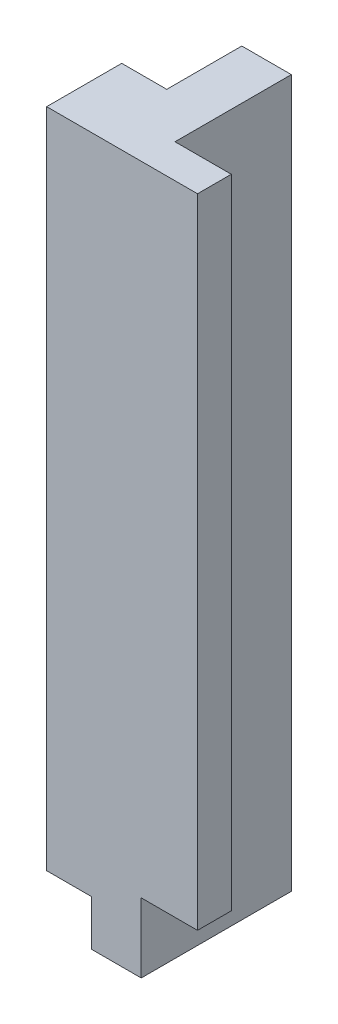
ISO-10303-21;
HEADER;
FILE_DESCRIPTION(('STEP AP214'),'2;1');
FILE_NAME('part.step','',(''),(''),'','','');
FILE_SCHEMA(('AUTOMOTIVE_DESIGN { 1 0 10303 214 1 1 1 1 }'));
ENDSEC;
DATA;
#1=APPLICATION_CONTEXT('core data for automotive mechanical design processes');
#2=APPLICATION_PROTOCOL_DEFINITION('international standard','automotive_design',2000,#1);
#3=PRODUCT_CONTEXT('',#1,'mechanical');
#4=PRODUCT('Part','Part','',(#3));
#5=PRODUCT_RELATED_PRODUCT_CATEGORY('part','',(#4));
#6=PRODUCT_DEFINITION_FORMATION('','',#4);
#7=PRODUCT_DEFINITION_CONTEXT('part definition',#1,'design');
#8=PRODUCT_DEFINITION('design','',#6,#7);
#9=PRODUCT_DEFINITION_SHAPE('','',#8);
#10=(LENGTH_UNIT() NAMED_UNIT(*) SI_UNIT(.MILLI.,.METRE.));
#11=(NAMED_UNIT(*) PLANE_ANGLE_UNIT() SI_UNIT($,.RADIAN.));
#12=(NAMED_UNIT(*) SI_UNIT($,.STERADIAN.) SOLID_ANGLE_UNIT());
#13=UNCERTAINTY_MEASURE_WITH_UNIT(LENGTH_MEASURE(1.E-05),#10,'distance_accuracy_value','');
#14=(GEOMETRIC_REPRESENTATION_CONTEXT(3) GLOBAL_UNCERTAINTY_ASSIGNED_CONTEXT((#13)) GLOBAL_UNIT_ASSIGNED_CONTEXT((#10,
#11,#12)) REPRESENTATION_CONTEXT('',''));
#15=CARTESIAN_POINT('',(0.,0.,0.));
#16=DIRECTION('',(0.,0.,1.));
#17=DIRECTION('',(1.,0.,0.));
#18=AXIS2_PLACEMENT_3D('',#15,#16,#17);
#19=CARTESIAN_POINT('',(6.6,94.25,0.));
#20=DIRECTION('',(-1.,0.,0.));
#21=DIRECTION('',(0.,0.,1.));
#22=AXIS2_PLACEMENT_3D('',#19,#20,#21);
#23=PLANE('',#22);
#24=DIRECTION('',(0.,1.,0.));
#25=VECTOR('',#24,1.);
#26=CARTESIAN_POINT('',(6.6,94.25,-4.5));
#27=LINE('',#26,#25);
#28=CARTESIAN_POINT('',(6.6,9.24999999999999,-4.50000000000001));
#29=VERTEX_POINT('',#28);
#30=CARTESIAN_POINT('',(6.6,94.25,-4.50000000000001));
#31=VERTEX_POINT('',#30);
#32=EDGE_CURVE('E130',#29,#31,#27,.T.);
#33=ORIENTED_EDGE('',*,*,#32,.F.);
#34=DIRECTION('',(0.,0.,-1.));
#35=VECTOR('',#34,1.);
#36=CARTESIAN_POINT('',(6.6,9.24999999999999,0.));
#37=LINE('',#36,#35);
#38=CARTESIAN_POINT('',(6.6,9.24999999999999,0.));
#39=VERTEX_POINT('',#38);
#40=EDGE_CURVE('E52',#39,#29,#37,.T.);
#41=ORIENTED_EDGE('',*,*,#40,.F.);
#42=DIRECTION('',(0.,-1.,0.));
#43=VECTOR('',#42,1.);
#44=CARTESIAN_POINT('',(6.6,94.25,0.));
#45=LINE('',#44,#43);
#46=CARTESIAN_POINT('',(6.6,0.,0.));
#47=VERTEX_POINT('',#46);
#48=EDGE_CURVE('E45',#39,#47,#45,.T.);
#49=ORIENTED_EDGE('',*,*,#48,.T.);
#50=DIRECTION('',(0.,0.,-1.));
#51=VECTOR('',#50,1.);
#52=CARTESIAN_POINT('',(6.6,0.,0.));
#53=LINE('',#52,#51);
#54=CARTESIAN_POINT('',(6.6,0.,-20.));
#55=VERTEX_POINT('',#54);
#56=EDGE_CURVE('E178',#47,#55,#53,.T.);
#57=ORIENTED_EDGE('',*,*,#56,.T.);
#58=DIRECTION('',(0.,-1.,0.));
#59=VECTOR('',#58,1.);
#60=CARTESIAN_POINT('',(6.6,94.25,-20.));
#61=LINE('',#60,#59);
#62=CARTESIAN_POINT('',(6.6,94.25,-20.));
#63=VERTEX_POINT('',#62);
#64=EDGE_CURVE('E183',#63,#55,#61,.T.);
#65=ORIENTED_EDGE('',*,*,#64,.F.);
#66=DIRECTION('',(0.,0.,-1.));
#67=VECTOR('',#66,1.);
#68=CARTESIAN_POINT('',(6.6,94.25,0.));
#69=LINE('',#68,#67);
#70=EDGE_CURVE('E58',#31,#63,#69,.T.);
#71=ORIENTED_EDGE('',*,*,#70,.F.);
#72=EDGE_LOOP('',(#33,#41,#49,#57,#65,#71));
#73=FACE_BOUND('',#72,.T.);
#74=ADVANCED_FACE('F37',(#73),#23,.F.);
#75=CARTESIAN_POINT('',(0.,94.25,0.));
#76=DIRECTION('',(1.,0.,0.));
#77=DIRECTION('',(0.,0.,-1.));
#78=AXIS2_PLACEMENT_3D('',#75,#76,#77);
#79=PLANE('',#78);
#80=DIRECTION('',(0.,0.,1.));
#81=VECTOR('',#80,1.);
#82=CARTESIAN_POINT('',(0.,6.08,0.));
#83=LINE('',#82,#81);
#84=CARTESIAN_POINT('',(0.,6.08,-9.99999999999999));
#85=VERTEX_POINT('',#84);
#86=CARTESIAN_POINT('',(0.,6.08,0.));
#87=VERTEX_POINT('',#86);
#88=EDGE_CURVE('E137',#85,#87,#83,.T.);
#89=ORIENTED_EDGE('',*,*,#88,.F.);
#90=DIRECTION('',(0.,-1.,0.));
#91=VECTOR('',#90,1.);
#92=CARTESIAN_POINT('',(0.,94.25,-10.));
#93=LINE('',#92,#91);
#94=CARTESIAN_POINT('',(0.,94.25,-9.99999999999999));
#95=VERTEX_POINT('',#94);
#96=EDGE_CURVE('E134',#95,#85,#93,.T.);
#97=ORIENTED_EDGE('',*,*,#96,.F.);
#98=DIRECTION('',(0.,0.,1.));
#99=VECTOR('',#98,1.);
#100=CARTESIAN_POINT('',(0.,94.25,0.));
#101=LINE('',#100,#99);
#102=CARTESIAN_POINT('',(0.,94.25,-20.));
#103=VERTEX_POINT('',#102);
#104=EDGE_CURVE('E164',#103,#95,#101,.T.);
#105=ORIENTED_EDGE('',*,*,#104,.F.);
#106=DIRECTION('',(0.,-1.,0.));
#107=VECTOR('',#106,1.);
#108=CARTESIAN_POINT('',(0.,94.25,-20.));
#109=LINE('',#108,#107);
#110=CARTESIAN_POINT('',(0.,0.,-20.));
#111=VERTEX_POINT('',#110);
#112=EDGE_CURVE('E173',#103,#111,#109,.T.);
#113=ORIENTED_EDGE('',*,*,#112,.T.);
#114=DIRECTION('',(0.,0.,1.));
#115=VECTOR('',#114,1.);
#116=CARTESIAN_POINT('',(0.,0.,0.));
#117=LINE('',#116,#115);
#118=CARTESIAN_POINT('',(0.,0.,0.));
#119=VERTEX_POINT('',#118);
#120=EDGE_CURVE('E163',#111,#119,#117,.T.);
#121=ORIENTED_EDGE('',*,*,#120,.T.);
#122=DIRECTION('',(0.,-1.,0.));
#123=VECTOR('',#122,1.);
#124=CARTESIAN_POINT('',(0.,94.25,0.));
#125=LINE('',#124,#123);
#126=EDGE_CURVE('E11',#87,#119,#125,.T.);
#127=ORIENTED_EDGE('',*,*,#126,.F.);
#128=EDGE_LOOP('',(#89,#97,#105,#113,#121,#127));
#129=FACE_BOUND('',#128,.T.);
#130=ADVANCED_FACE('F39',(#129),#79,.F.);
#131=CARTESIAN_POINT('',(0.,94.25,0.));
#132=DIRECTION('',(0.,0.,-1.));
#133=DIRECTION('',(-1.,0.,0.));
#134=AXIS2_PLACEMENT_3D('',#131,#132,#133);
#135=PLANE('',#134);
#136=DIRECTION('',(1.,0.,0.));
#137=VECTOR('',#136,1.);
#138=CARTESIAN_POINT('',(0.,0.,0.));
#139=LINE('',#138,#137);
#140=EDGE_CURVE('E176',#119,#47,#139,.T.);
#141=ORIENTED_EDGE('',*,*,#140,.T.);
#142=ORIENTED_EDGE('',*,*,#48,.F.);
#143=DIRECTION('',(-1.,0.,0.));
#144=VECTOR('',#143,1.);
#145=CARTESIAN_POINT('',(14.1,9.24999999999999,0.));
#146=LINE('',#145,#144);
#147=CARTESIAN_POINT('',(14.1,9.24999999999999,0.));
#148=VERTEX_POINT('',#147);
#149=EDGE_CURVE('E116',#148,#39,#146,.T.);
#150=ORIENTED_EDGE('',*,*,#149,.F.);
#151=DIRECTION('',(0.,-1.,0.));
#152=VECTOR('',#151,1.);
#153=CARTESIAN_POINT('',(14.1,94.25,0.));
#154=LINE('',#153,#152);
#155=CARTESIAN_POINT('',(14.1,94.25,0.));
#156=VERTEX_POINT('',#155);
#157=EDGE_CURVE('E122',#156,#148,#154,.T.);
#158=ORIENTED_EDGE('',*,*,#157,.F.);
#159=DIRECTION('',(1.,0.,0.));
#160=VECTOR('',#159,1.);
#161=CARTESIAN_POINT('',(0.,94.25,0.));
#162=LINE('',#161,#160);
#163=CARTESIAN_POINT('',(-6.,94.25,0.));
#164=VERTEX_POINT('',#163);
#165=EDGE_CURVE('E167',#164,#156,#162,.T.);
#166=ORIENTED_EDGE('',*,*,#165,.F.);
#167=DIRECTION('',(0.,1.,0.));
#168=VECTOR('',#167,1.);
#169=CARTESIAN_POINT('',(-6.,94.25,0.));
#170=LINE('',#169,#168);
#171=CARTESIAN_POINT('',(-6.,6.08,0.));
#172=VERTEX_POINT('',#171);
#173=EDGE_CURVE('E143',#172,#164,#170,.T.);
#174=ORIENTED_EDGE('',*,*,#173,.F.);
#175=DIRECTION('',(1.,0.,0.));
#176=VECTOR('',#175,1.);
#177=CARTESIAN_POINT('',(-6.,6.08,0.));
#178=LINE('',#177,#176);
#179=EDGE_CURVE('E151',#172,#87,#178,.T.);
#180=ORIENTED_EDGE('',*,*,#179,.T.);
#181=ORIENTED_EDGE('',*,*,#126,.T.);
#182=EDGE_LOOP('',(#141,#142,#150,#158,#166,#174,#180,#181));
#183=FACE_BOUND('',#182,.T.);
#184=ADVANCED_FACE('F133',(#183),#135,.F.);
#185=CARTESIAN_POINT('',(0.,94.25,-20.));
#186=DIRECTION('',(0.,0.,1.));
#187=DIRECTION('',(1.,0.,0.));
#188=AXIS2_PLACEMENT_3D('',#185,#186,#187);
#189=PLANE('',#188);
#190=DIRECTION('',(-1.,0.,0.));
#191=VECTOR('',#190,1.);
#192=CARTESIAN_POINT('',(0.,0.,-20.));
#193=LINE('',#192,#191);
#194=EDGE_CURVE('E168',#55,#111,#193,.T.);
#195=ORIENTED_EDGE('',*,*,#194,.T.);
#196=ORIENTED_EDGE('',*,*,#112,.F.);
#197=DIRECTION('',(-1.,0.,0.));
#198=VECTOR('',#197,1.);
#199=CARTESIAN_POINT('',(0.,94.25,-20.));
#200=LINE('',#199,#198);
#201=EDGE_CURVE('E171',#63,#103,#200,.T.);
#202=ORIENTED_EDGE('',*,*,#201,.F.);
#203=ORIENTED_EDGE('',*,*,#64,.T.);
#204=EDGE_LOOP('',(#195,#196,#202,#203));
#205=FACE_BOUND('',#204,.T.);
#206=ADVANCED_FACE('F193',(#205),#189,.F.);
#207=CARTESIAN_POINT('',(0.,94.25,0.));
#208=DIRECTION('',(0.,-1.,0.));
#209=DIRECTION('',(0.,0.,-1.));
#210=AXIS2_PLACEMENT_3D('',#207,#208,#209);
#211=PLANE('',#210);
#212=ORIENTED_EDGE('',*,*,#104,.T.);
#213=DIRECTION('',(1.,0.,0.));
#214=VECTOR('',#213,1.);
#215=CARTESIAN_POINT('',(-6.,94.25,-10.));
#216=LINE('',#215,#214);
#217=CARTESIAN_POINT('',(-6.,94.25,-10.));
#218=VERTEX_POINT('',#217);
#219=EDGE_CURVE('E160',#218,#95,#216,.T.);
#220=ORIENTED_EDGE('',*,*,#219,.F.);
#221=DIRECTION('',(0.,0.,-1.));
#222=VECTOR('',#221,1.);
#223=CARTESIAN_POINT('',(-6.,94.25,0.));
#224=LINE('',#223,#222);
#225=EDGE_CURVE('E146',#164,#218,#224,.T.);
#226=ORIENTED_EDGE('',*,*,#225,.F.);
#227=ORIENTED_EDGE('',*,*,#165,.T.);
#228=DIRECTION('',(0.,0.,1.));
#229=VECTOR('',#228,1.);
#230=CARTESIAN_POINT('',(14.1,94.25,0.));
#231=LINE('',#230,#229);
#232=CARTESIAN_POINT('',(14.1,94.25,-4.5));
#233=VERTEX_POINT('',#232);
#234=EDGE_CURVE('E128',#233,#156,#231,.T.);
#235=ORIENTED_EDGE('',*,*,#234,.F.);
#236=DIRECTION('',(-1.,0.,0.));
#237=VECTOR('',#236,1.);
#238=CARTESIAN_POINT('',(14.1,94.25,-4.5));
#239=LINE('',#238,#237);
#240=EDGE_CURVE('E139',#233,#31,#239,.T.);
#241=ORIENTED_EDGE('',*,*,#240,.T.);
#242=ORIENTED_EDGE('',*,*,#70,.T.);
#243=ORIENTED_EDGE('',*,*,#201,.T.);
#244=EDGE_LOOP('',(#212,#220,#226,#227,#235,#241,#242,#243));
#245=FACE_BOUND('',#244,.T.);
#246=ADVANCED_FACE('F199',(#245),#211,.F.);
#247=CARTESIAN_POINT('',(0.,0.,0.));
#248=DIRECTION('',(0.,-1.,0.));
#249=DIRECTION('',(0.,0.,-1.));
#250=AXIS2_PLACEMENT_3D('',#247,#248,#249);
#251=PLANE('',#250);
#252=ORIENTED_EDGE('',*,*,#120,.F.);
#253=ORIENTED_EDGE('',*,*,#194,.F.);
#254=ORIENTED_EDGE('',*,*,#56,.F.);
#255=ORIENTED_EDGE('',*,*,#140,.F.);
#256=EDGE_LOOP('',(#252,#253,#254,#255));
#257=FACE_BOUND('',#256,.T.);
#258=ADVANCED_FACE('F190',(#257),#251,.T.);
#259=CARTESIAN_POINT('',(-6.,94.25,-10.));
#260=DIRECTION('',(0.,0.,1.));
#261=DIRECTION('',(0.,-1.,0.));
#262=AXIS2_PLACEMENT_3D('',#259,#260,#261);
#263=PLANE('',#262);
#264=ORIENTED_EDGE('',*,*,#96,.T.);
#265=DIRECTION('',(1.,0.,0.));
#266=VECTOR('',#265,1.);
#267=CARTESIAN_POINT('',(-6.,6.08,-9.99999999999999));
#268=LINE('',#267,#266);
#269=CARTESIAN_POINT('',(-6.,6.08,-9.99999999999999));
#270=VERTEX_POINT('',#269);
#271=EDGE_CURVE('E157',#270,#85,#268,.T.);
#272=ORIENTED_EDGE('',*,*,#271,.F.);
#273=DIRECTION('',(0.,-1.,0.));
#274=VECTOR('',#273,1.);
#275=CARTESIAN_POINT('',(-6.,94.25,-10.));
#276=LINE('',#275,#274);
#277=EDGE_CURVE('E148',#218,#270,#276,.T.);
#278=ORIENTED_EDGE('',*,*,#277,.F.);
#279=ORIENTED_EDGE('',*,*,#219,.T.);
#280=EDGE_LOOP('',(#264,#272,#278,#279));
#281=FACE_BOUND('',#280,.T.);
#282=ADVANCED_FACE('F203',(#281),#263,.F.);
#283=CARTESIAN_POINT('',(-6.,6.08,0.));
#284=DIRECTION('',(0.,1.,0.));
#285=DIRECTION('',(0.,0.,1.));
#286=AXIS2_PLACEMENT_3D('',#283,#284,#285);
#287=PLANE('',#286);
#288=ORIENTED_EDGE('',*,*,#88,.T.);
#289=ORIENTED_EDGE('',*,*,#179,.F.);
#290=DIRECTION('',(0.,0.,1.));
#291=VECTOR('',#290,1.);
#292=CARTESIAN_POINT('',(-6.,6.08,0.));
#293=LINE('',#292,#291);
#294=EDGE_CURVE('E150',#270,#172,#293,.T.);
#295=ORIENTED_EDGE('',*,*,#294,.F.);
#296=ORIENTED_EDGE('',*,*,#271,.T.);
#297=EDGE_LOOP('',(#288,#289,#295,#296));
#298=FACE_BOUND('',#297,.T.);
#299=ADVANCED_FACE('F212',(#298),#287,.F.);
#300=CARTESIAN_POINT('',(-6.,0.,0.));
#301=DIRECTION('',(1.,0.,0.));
#302=DIRECTION('',(0.,0.,-1.));
#303=AXIS2_PLACEMENT_3D('',#300,#301,#302);
#304=PLANE('',#303);
#305=ORIENTED_EDGE('',*,*,#173,.T.);
#306=ORIENTED_EDGE('',*,*,#225,.T.);
#307=ORIENTED_EDGE('',*,*,#277,.T.);
#308=ORIENTED_EDGE('',*,*,#294,.T.);
#309=EDGE_LOOP('',(#305,#306,#307,#308));
#310=FACE_BOUND('',#309,.T.);
#311=ADVANCED_FACE('F207',(#310),#304,.F.);
#312=CARTESIAN_POINT('',(14.1,9.24999999999999,0.));
#313=DIRECTION('',(0.,1.,0.));
#314=DIRECTION('',(0.,0.,1.));
#315=AXIS2_PLACEMENT_3D('',#312,#313,#314);
#316=PLANE('',#315);
#317=ORIENTED_EDGE('',*,*,#40,.T.);
#318=DIRECTION('',(-1.,0.,0.));
#319=VECTOR('',#318,1.);
#320=CARTESIAN_POINT('',(14.1,9.24999999999999,-4.50000000000001));
#321=LINE('',#320,#319);
#322=CARTESIAN_POINT('',(14.1,9.24999999999999,-4.50000000000001));
#323=VERTEX_POINT('',#322);
#324=EDGE_CURVE('E118',#323,#29,#321,.T.);
#325=ORIENTED_EDGE('',*,*,#324,.F.);
#326=DIRECTION('',(0.,0.,-1.));
#327=VECTOR('',#326,1.);
#328=CARTESIAN_POINT('',(14.1,9.24999999999999,0.));
#329=LINE('',#328,#327);
#330=EDGE_CURVE('E112',#148,#323,#329,.T.);
#331=ORIENTED_EDGE('',*,*,#330,.F.);
#332=ORIENTED_EDGE('',*,*,#149,.T.);
#333=EDGE_LOOP('',(#317,#325,#331,#332));
#334=FACE_BOUND('',#333,.T.);
#335=ADVANCED_FACE('F114',(#334),#316,.F.);
#336=CARTESIAN_POINT('',(14.1,94.25,-4.5));
#337=DIRECTION('',(0.,0.,1.));
#338=DIRECTION('',(0.,-1.,0.));
#339=AXIS2_PLACEMENT_3D('',#336,#337,#338);
#340=PLANE('',#339);
#341=ORIENTED_EDGE('',*,*,#32,.T.);
#342=ORIENTED_EDGE('',*,*,#240,.F.);
#343=DIRECTION('',(0.,1.,0.));
#344=VECTOR('',#343,1.);
#345=CARTESIAN_POINT('',(14.1,94.25,-4.5));
#346=LINE('',#345,#344);
#347=EDGE_CURVE('E121',#323,#233,#346,.T.);
#348=ORIENTED_EDGE('',*,*,#347,.F.);
#349=ORIENTED_EDGE('',*,*,#324,.T.);
#350=EDGE_LOOP('',(#341,#342,#348,#349));
#351=FACE_BOUND('',#350,.T.);
#352=ADVANCED_FACE('F285',(#351),#340,.F.);
#353=CARTESIAN_POINT('',(14.1,0.,0.));
#354=DIRECTION('',(1.,0.,0.));
#355=DIRECTION('',(0.,0.,-1.));
#356=AXIS2_PLACEMENT_3D('',#353,#354,#355);
#357=PLANE('',#356);
#358=ORIENTED_EDGE('',*,*,#157,.T.);
#359=ORIENTED_EDGE('',*,*,#330,.T.);
#360=ORIENTED_EDGE('',*,*,#347,.T.);
#361=ORIENTED_EDGE('',*,*,#234,.T.);
#362=EDGE_LOOP('',(#358,#359,#360,#361));
#363=FACE_BOUND('',#362,.T.);
#364=ADVANCED_FACE('F126',(#363),#357,.T.);
#365=CLOSED_SHELL('',(#74,#130,#184,#206,#246,#258,#282,#299,#311,#335,#352,#364));
#366=MANIFOLD_SOLID_BREP('B2',#365);
#367=ADVANCED_BREP_SHAPE_REPRESENTATION('',(#18,#366),#14);
#368=SHAPE_DEFINITION_REPRESENTATION(#9,#367);
ENDSEC;
END-ISO-10303-21;
